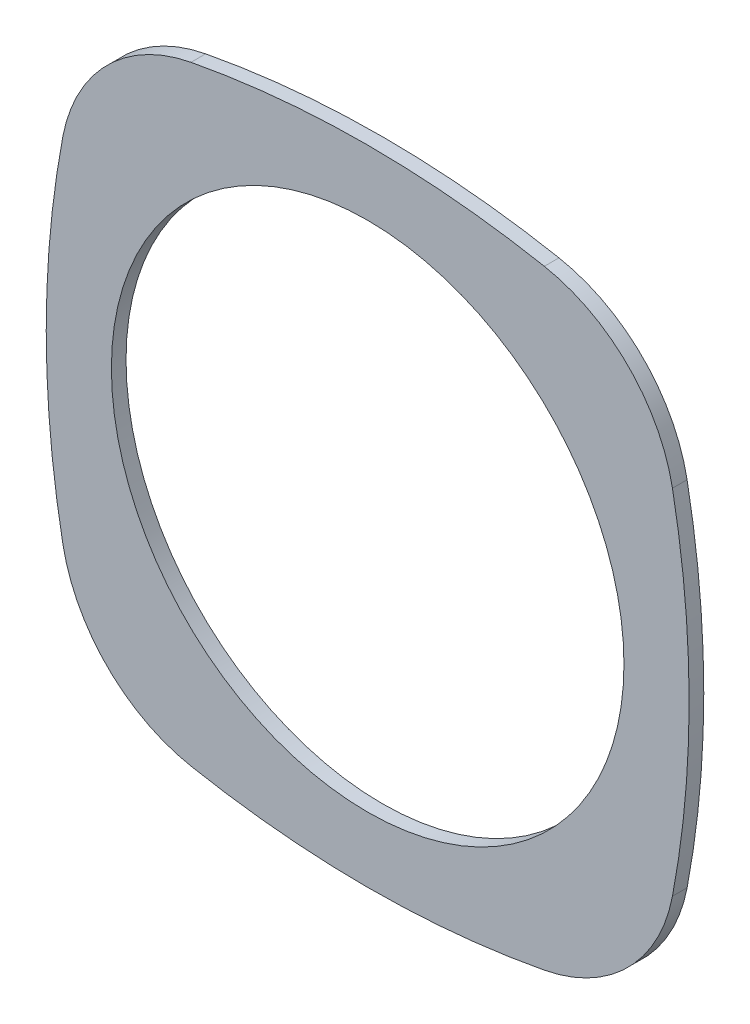
ISO-10303-21;
HEADER;
FILE_DESCRIPTION(('STEP AP214'),'2;1');
FILE_NAME('part.step','',(''),(''),'','','');
FILE_SCHEMA(('AUTOMOTIVE_DESIGN { 1 0 10303 214 1 1 1 1 }'));
ENDSEC;
DATA;
#1=APPLICATION_CONTEXT('core data for automotive mechanical design processes');
#2=APPLICATION_PROTOCOL_DEFINITION('international standard','automotive_design',2000,#1);
#3=PRODUCT_CONTEXT('',#1,'mechanical');
#4=PRODUCT('Part','Part','',(#3));
#5=PRODUCT_RELATED_PRODUCT_CATEGORY('part','',(#4));
#6=PRODUCT_DEFINITION_FORMATION('','',#4);
#7=PRODUCT_DEFINITION_CONTEXT('part definition',#1,'design');
#8=PRODUCT_DEFINITION('design','',#6,#7);
#9=PRODUCT_DEFINITION_SHAPE('','',#8);
#10=(LENGTH_UNIT() NAMED_UNIT(*) SI_UNIT(.MILLI.,.METRE.));
#11=(NAMED_UNIT(*) PLANE_ANGLE_UNIT() SI_UNIT($,.RADIAN.));
#12=(NAMED_UNIT(*) SI_UNIT($,.STERADIAN.) SOLID_ANGLE_UNIT());
#13=UNCERTAINTY_MEASURE_WITH_UNIT(LENGTH_MEASURE(1.E-05),#10,'distance_accuracy_value','');
#14=(GEOMETRIC_REPRESENTATION_CONTEXT(3) GLOBAL_UNCERTAINTY_ASSIGNED_CONTEXT((#13)) GLOBAL_UNIT_ASSIGNED_CONTEXT((#10,
#11,#12)) REPRESENTATION_CONTEXT('',''));
#15=CARTESIAN_POINT('',(0.,0.,0.));
#16=DIRECTION('',(0.,0.,1.));
#17=DIRECTION('',(1.,0.,0.));
#18=AXIS2_PLACEMENT_3D('',#15,#16,#17);
#19=CARTESIAN_POINT('',(5.00278047689482,-16.2585175185364,1.));
#20=DIRECTION('',(0.,0.,1.));
#21=DIRECTION('',(1.,0.,0.));
#22=AXIS2_PLACEMENT_3D('',#19,#20,#21);
#23=PLANE('',#22);
#24=CARTESIAN_POINT('',(10.0055609537896,10.0055609537896,1.));
#25=DIRECTION('',(0.,0.,1.));
#26=DIRECTION('',(1.,0.,0.));
#27=AXIS2_PLACEMENT_3D('',#24,#25,#26);
#28=CIRCLE('',#27,11.);
#29=CARTESIAN_POINT('',(20.8112777080297,12.0638333913293,1.));
#30=VERTEX_POINT('',#29);
#31=CARTESIAN_POINT('',(12.0638333913293,20.8112777080297,1.));
#32=VERTEX_POINT('',#31);
#33=EDGE_CURVE('E168',#30,#32,#28,.T.);
#34=ORIENTED_EDGE('',*,*,#33,.T.);
#35=CARTESIAN_POINT('',(0.,-42.5225959908624,1.));
#36=DIRECTION('',(0.,0.,1.));
#37=DIRECTION('',(1.,0.,0.));
#38=AXIS2_PLACEMENT_3D('',#35,#36,#37);
#39=CIRCLE('',#38,64.4725959908624);
#40=CARTESIAN_POINT('',(-12.0638333913293,20.8112777080297,1.));
#41=VERTEX_POINT('',#40);
#42=EDGE_CURVE('E104',#32,#41,#39,.T.);
#43=ORIENTED_EDGE('',*,*,#42,.T.);
#44=CARTESIAN_POINT('',(-10.0055609537896,10.0055609537896,1.));
#45=DIRECTION('',(0.,0.,1.));
#46=DIRECTION('',(1.,0.,0.));
#47=AXIS2_PLACEMENT_3D('',#44,#45,#46);
#48=CIRCLE('',#47,11.);
#49=CARTESIAN_POINT('',(-20.8112777080297,12.0638333913293,1.));
#50=VERTEX_POINT('',#49);
#51=EDGE_CURVE('E189',#41,#50,#48,.T.);
#52=ORIENTED_EDGE('',*,*,#51,.T.);
#53=CARTESIAN_POINT('',(42.5225959908624,0.,1.));
#54=DIRECTION('',(0.,0.,1.));
#55=DIRECTION('',(1.,0.,0.));
#56=AXIS2_PLACEMENT_3D('',#53,#54,#55);
#57=CIRCLE('',#56,64.4725959908624);
#58=CARTESIAN_POINT('',(-20.8112777080297,-12.0638333913293,1.));
#59=VERTEX_POINT('',#58);
#60=EDGE_CURVE('E203',#50,#59,#57,.T.);
#61=ORIENTED_EDGE('',*,*,#60,.T.);
#62=CARTESIAN_POINT('',(-10.0055609537896,-10.0055609537896,1.));
#63=DIRECTION('',(0.,0.,1.));
#64=DIRECTION('',(1.,0.,0.));
#65=AXIS2_PLACEMENT_3D('',#62,#63,#64);
#66=CIRCLE('',#65,11.);
#67=CARTESIAN_POINT('',(-12.0638333913293,-20.8112777080297,1.));
#68=VERTEX_POINT('',#67);
#69=EDGE_CURVE('E123',#59,#68,#66,.T.);
#70=ORIENTED_EDGE('',*,*,#69,.T.);
#71=CARTESIAN_POINT('',(0.,42.5225959908624,1.));
#72=DIRECTION('',(0.,0.,1.));
#73=DIRECTION('',(1.,0.,0.));
#74=AXIS2_PLACEMENT_3D('',#71,#72,#73);
#75=CIRCLE('',#74,64.4725959908624);
#76=CARTESIAN_POINT('',(12.0638333913293,-20.8112777080297,1.));
#77=VERTEX_POINT('',#76);
#78=EDGE_CURVE('E117',#68,#77,#75,.T.);
#79=ORIENTED_EDGE('',*,*,#78,.T.);
#80=CARTESIAN_POINT('',(10.0055609537896,-10.0055609537896,1.));
#81=DIRECTION('',(0.,0.,1.));
#82=DIRECTION('',(1.,0.,0.));
#83=AXIS2_PLACEMENT_3D('',#80,#81,#82);
#84=CIRCLE('',#83,11.);
#85=CARTESIAN_POINT('',(20.8112777080297,-12.0638333913293,1.));
#86=VERTEX_POINT('',#85);
#87=EDGE_CURVE('E121',#77,#86,#84,.T.);
#88=ORIENTED_EDGE('',*,*,#87,.T.);
#89=CARTESIAN_POINT('',(-42.5225959908624,0.,1.));
#90=DIRECTION('',(0.,0.,1.));
#91=DIRECTION('',(1.,0.,0.));
#92=AXIS2_PLACEMENT_3D('',#89,#90,#91);
#93=CIRCLE('',#92,64.4725959908624);
#94=EDGE_CURVE('E61',#86,#30,#93,.T.);
#95=ORIENTED_EDGE('',*,*,#94,.T.);
#96=EDGE_LOOP('',(#34,#43,#52,#61,#70,#79,#88,#95));
#97=FACE_BOUND('',#96,.T.);
#98=CARTESIAN_POINT('',(0.,0.,1.));
#99=DIRECTION('',(0.,0.,1.));
#100=DIRECTION('',(1.,0.,0.));
#101=AXIS2_PLACEMENT_3D('',#98,#99,#100);
#102=CIRCLE('',#101,17.5);
#103=CARTESIAN_POINT('',(17.5,0.,1.));
#104=VERTEX_POINT('',#103);
#105=EDGE_CURVE('E150',#104,#104,#102,.T.);
#106=ORIENTED_EDGE('',*,*,#105,.F.);
#107=EDGE_LOOP('',(#106));
#108=FACE_BOUND('',#107,.T.);
#109=ADVANCED_FACE('F43',(#97,#108),#23,.T.);
#110=CARTESIAN_POINT('',(5.00278047689482,-16.2585175185364,0.));
#111=DIRECTION('',(0.,0.,1.));
#112=DIRECTION('',(1.,0.,0.));
#113=AXIS2_PLACEMENT_3D('',#110,#111,#112);
#114=PLANE('',#113);
#115=CARTESIAN_POINT('',(10.0055609537896,10.0055609537896,0.));
#116=DIRECTION('',(0.,0.,1.));
#117=DIRECTION('',(1.,0.,0.));
#118=AXIS2_PLACEMENT_3D('',#115,#116,#117);
#119=CIRCLE('',#118,11.);
#120=CARTESIAN_POINT('',(20.8112777080297,12.0638333913293,0.));
#121=VERTEX_POINT('',#120);
#122=CARTESIAN_POINT('',(12.0638333913293,20.8112777080297,0.));
#123=VERTEX_POINT('',#122);
#124=EDGE_CURVE('E145',#121,#123,#119,.T.);
#125=ORIENTED_EDGE('',*,*,#124,.F.);
#126=CARTESIAN_POINT('',(-42.5225959908624,0.,0.));
#127=DIRECTION('',(0.,0.,1.));
#128=DIRECTION('',(1.,0.,0.));
#129=AXIS2_PLACEMENT_3D('',#126,#127,#128);
#130=CIRCLE('',#129,64.4725959908624);
#131=CARTESIAN_POINT('',(20.8112777080297,-12.0638333913293,0.));
#132=VERTEX_POINT('',#131);
#133=EDGE_CURVE('E96',#132,#121,#130,.T.);
#134=ORIENTED_EDGE('',*,*,#133,.F.);
#135=CARTESIAN_POINT('',(10.0055609537896,-10.0055609537896,0.));
#136=DIRECTION('',(0.,0.,1.));
#137=DIRECTION('',(1.,0.,0.));
#138=AXIS2_PLACEMENT_3D('',#135,#136,#137);
#139=CIRCLE('',#138,11.);
#140=CARTESIAN_POINT('',(12.0638333913293,-20.8112777080297,0.));
#141=VERTEX_POINT('',#140);
#142=EDGE_CURVE('E90',#141,#132,#139,.T.);
#143=ORIENTED_EDGE('',*,*,#142,.F.);
#144=CARTESIAN_POINT('',(0.,42.5225959908624,0.));
#145=DIRECTION('',(0.,0.,1.));
#146=DIRECTION('',(1.,0.,0.));
#147=AXIS2_PLACEMENT_3D('',#144,#145,#146);
#148=CIRCLE('',#147,64.4725959908624);
#149=CARTESIAN_POINT('',(-12.0638333913293,-20.8112777080297,0.));
#150=VERTEX_POINT('',#149);
#151=EDGE_CURVE('E132',#150,#141,#148,.T.);
#152=ORIENTED_EDGE('',*,*,#151,.F.);
#153=CARTESIAN_POINT('',(-10.0055609537896,-10.0055609537896,0.));
#154=DIRECTION('',(0.,0.,1.));
#155=DIRECTION('',(1.,0.,0.));
#156=AXIS2_PLACEMENT_3D('',#153,#154,#155);
#157=CIRCLE('',#156,11.);
#158=CARTESIAN_POINT('',(-20.8112777080297,-12.0638333913293,0.));
#159=VERTEX_POINT('',#158);
#160=EDGE_CURVE('E159',#159,#150,#157,.T.);
#161=ORIENTED_EDGE('',*,*,#160,.F.);
#162=CARTESIAN_POINT('',(42.5225959908624,0.,0.));
#163=DIRECTION('',(0.,0.,1.));
#164=DIRECTION('',(1.,0.,0.));
#165=AXIS2_PLACEMENT_3D('',#162,#163,#164);
#166=CIRCLE('',#165,64.4725959908624);
#167=CARTESIAN_POINT('',(-20.8112777080297,12.0638333913293,0.));
#168=VERTEX_POINT('',#167);
#169=EDGE_CURVE('E156',#168,#159,#166,.T.);
#170=ORIENTED_EDGE('',*,*,#169,.F.);
#171=CARTESIAN_POINT('',(-10.0055609537896,10.0055609537896,0.));
#172=DIRECTION('',(0.,0.,1.));
#173=DIRECTION('',(1.,0.,0.));
#174=AXIS2_PLACEMENT_3D('',#171,#172,#173);
#175=CIRCLE('',#174,11.);
#176=CARTESIAN_POINT('',(-12.0638333913293,20.8112777080297,0.));
#177=VERTEX_POINT('',#176);
#178=EDGE_CURVE('E153',#177,#168,#175,.T.);
#179=ORIENTED_EDGE('',*,*,#178,.F.);
#180=CARTESIAN_POINT('',(0.,-42.5225959908624,0.));
#181=DIRECTION('',(0.,0.,1.));
#182=DIRECTION('',(1.,0.,0.));
#183=AXIS2_PLACEMENT_3D('',#180,#181,#182);
#184=CIRCLE('',#183,64.4725959908624);
#185=EDGE_CURVE('E149',#123,#177,#184,.T.);
#186=ORIENTED_EDGE('',*,*,#185,.F.);
#187=EDGE_LOOP('',(#125,#134,#143,#152,#161,#170,#179,#186));
#188=FACE_BOUND('',#187,.T.);
#189=CARTESIAN_POINT('',(0.,0.,0.));
#190=DIRECTION('',(0.,0.,1.));
#191=DIRECTION('',(1.,0.,0.));
#192=AXIS2_PLACEMENT_3D('',#189,#190,#191);
#193=CIRCLE('',#192,17.5);
#194=CARTESIAN_POINT('',(17.5,0.,0.));
#195=VERTEX_POINT('',#194);
#196=EDGE_CURVE('E213',#195,#195,#193,.T.);
#197=ORIENTED_EDGE('',*,*,#196,.T.);
#198=EDGE_LOOP('',(#197));
#199=FACE_BOUND('',#198,.T.);
#200=ADVANCED_FACE('F193',(#188,#199),#114,.F.);
#201=CARTESIAN_POINT('',(10.0055609537896,10.0055609537896,1.));
#202=DIRECTION('',(0.,0.,-1.));
#203=DIRECTION('',(-1.,0.,0.));
#204=AXIS2_PLACEMENT_3D('',#201,#202,#203);
#205=CYLINDRICAL_SURFACE('',#204,11.);
#206=ORIENTED_EDGE('',*,*,#124,.T.);
#207=DIRECTION('',(0.,0.,-1.));
#208=VECTOR('',#207,1.);
#209=CARTESIAN_POINT('',(12.0638333913293,20.8112777080297,1.));
#210=LINE('',#209,#208);
#211=EDGE_CURVE('E11',#32,#123,#210,.T.);
#212=ORIENTED_EDGE('',*,*,#211,.F.);
#213=ORIENTED_EDGE('',*,*,#33,.F.);
#214=DIRECTION('',(0.,0.,-1.));
#215=VECTOR('',#214,1.);
#216=CARTESIAN_POINT('',(20.8112777080297,12.0638333913293,1.));
#217=LINE('',#216,#215);
#218=EDGE_CURVE('E141',#30,#121,#217,.T.);
#219=ORIENTED_EDGE('',*,*,#218,.T.);
#220=EDGE_LOOP('',(#206,#212,#213,#219));
#221=FACE_BOUND('',#220,.T.);
#222=ADVANCED_FACE('F45',(#221),#205,.T.);
#223=CARTESIAN_POINT('',(0.,-42.5225959908624,1.));
#224=DIRECTION('',(0.,0.,-1.));
#225=DIRECTION('',(-1.,0.,0.));
#226=AXIS2_PLACEMENT_3D('',#223,#224,#225);
#227=CYLINDRICAL_SURFACE('',#226,64.4725959908624);
#228=ORIENTED_EDGE('',*,*,#185,.T.);
#229=DIRECTION('',(0.,0.,-1.));
#230=VECTOR('',#229,1.);
#231=CARTESIAN_POINT('',(-12.0638333913293,20.8112777080297,1.));
#232=LINE('',#231,#230);
#233=EDGE_CURVE('E53',#41,#177,#232,.T.);
#234=ORIENTED_EDGE('',*,*,#233,.F.);
#235=ORIENTED_EDGE('',*,*,#42,.F.);
#236=ORIENTED_EDGE('',*,*,#211,.T.);
#237=EDGE_LOOP('',(#228,#234,#235,#236));
#238=FACE_BOUND('',#237,.T.);
#239=ADVANCED_FACE('F243',(#238),#227,.T.);
#240=CARTESIAN_POINT('',(-10.0055609537896,10.0055609537896,1.));
#241=DIRECTION('',(0.,0.,-1.));
#242=DIRECTION('',(-1.,0.,0.));
#243=AXIS2_PLACEMENT_3D('',#240,#241,#242);
#244=CYLINDRICAL_SURFACE('',#243,11.);
#245=ORIENTED_EDGE('',*,*,#178,.T.);
#246=DIRECTION('',(0.,0.,-1.));
#247=VECTOR('',#246,1.);
#248=CARTESIAN_POINT('',(-20.8112777080297,12.0638333913293,1.));
#249=LINE('',#248,#247);
#250=EDGE_CURVE('E179',#50,#168,#249,.T.);
#251=ORIENTED_EDGE('',*,*,#250,.F.);
#252=ORIENTED_EDGE('',*,*,#51,.F.);
#253=ORIENTED_EDGE('',*,*,#233,.T.);
#254=EDGE_LOOP('',(#245,#251,#252,#253));
#255=FACE_BOUND('',#254,.T.);
#256=ADVANCED_FACE('F187',(#255),#244,.T.);
#257=CARTESIAN_POINT('',(42.5225959908624,0.,1.));
#258=DIRECTION('',(0.,0.,-1.));
#259=DIRECTION('',(-1.,0.,0.));
#260=AXIS2_PLACEMENT_3D('',#257,#258,#259);
#261=CYLINDRICAL_SURFACE('',#260,64.4725959908624);
#262=ORIENTED_EDGE('',*,*,#169,.T.);
#263=DIRECTION('',(0.,0.,-1.));
#264=VECTOR('',#263,1.);
#265=CARTESIAN_POINT('',(-20.8112777080297,-12.0638333913293,1.));
#266=LINE('',#265,#264);
#267=EDGE_CURVE('E175',#59,#159,#266,.T.);
#268=ORIENTED_EDGE('',*,*,#267,.F.);
#269=ORIENTED_EDGE('',*,*,#60,.F.);
#270=ORIENTED_EDGE('',*,*,#250,.T.);
#271=EDGE_LOOP('',(#262,#268,#269,#270));
#272=FACE_BOUND('',#271,.T.);
#273=ADVANCED_FACE('F198',(#272),#261,.T.);
#274=CARTESIAN_POINT('',(-10.0055609537896,-10.0055609537896,1.));
#275=DIRECTION('',(0.,0.,-1.));
#276=DIRECTION('',(-1.,0.,0.));
#277=AXIS2_PLACEMENT_3D('',#274,#275,#276);
#278=CYLINDRICAL_SURFACE('',#277,11.);
#279=ORIENTED_EDGE('',*,*,#160,.T.);
#280=DIRECTION('',(0.,0.,-1.));
#281=VECTOR('',#280,1.);
#282=CARTESIAN_POINT('',(-12.0638333913293,-20.8112777080297,1.));
#283=LINE('',#282,#281);
#284=EDGE_CURVE('E134',#68,#150,#283,.T.);
#285=ORIENTED_EDGE('',*,*,#284,.F.);
#286=ORIENTED_EDGE('',*,*,#69,.F.);
#287=ORIENTED_EDGE('',*,*,#267,.T.);
#288=EDGE_LOOP('',(#279,#285,#286,#287));
#289=FACE_BOUND('',#288,.T.);
#290=ADVANCED_FACE('F201',(#289),#278,.T.);
#291=CARTESIAN_POINT('',(0.,42.5225959908624,1.));
#292=DIRECTION('',(0.,0.,-1.));
#293=DIRECTION('',(-1.,0.,0.));
#294=AXIS2_PLACEMENT_3D('',#291,#292,#293);
#295=CYLINDRICAL_SURFACE('',#294,64.4725959908624);
#296=ORIENTED_EDGE('',*,*,#151,.T.);
#297=DIRECTION('',(0.,0.,-1.));
#298=VECTOR('',#297,1.);
#299=CARTESIAN_POINT('',(12.0638333913293,-20.8112777080297,1.));
#300=LINE('',#299,#298);
#301=EDGE_CURVE('E129',#77,#141,#300,.T.);
#302=ORIENTED_EDGE('',*,*,#301,.F.);
#303=ORIENTED_EDGE('',*,*,#78,.F.);
#304=ORIENTED_EDGE('',*,*,#284,.T.);
#305=EDGE_LOOP('',(#296,#302,#303,#304));
#306=FACE_BOUND('',#305,.T.);
#307=ADVANCED_FACE('F130',(#306),#295,.T.);
#308=CARTESIAN_POINT('',(10.0055609537896,-10.0055609537896,1.));
#309=DIRECTION('',(0.,0.,-1.));
#310=DIRECTION('',(-1.,0.,0.));
#311=AXIS2_PLACEMENT_3D('',#308,#309,#310);
#312=CYLINDRICAL_SURFACE('',#311,11.);
#313=ORIENTED_EDGE('',*,*,#142,.T.);
#314=DIRECTION('',(0.,0.,-1.));
#315=VECTOR('',#314,1.);
#316=CARTESIAN_POINT('',(20.8112777080297,-12.0638333913293,1.));
#317=LINE('',#316,#315);
#318=EDGE_CURVE('E135',#86,#132,#317,.T.);
#319=ORIENTED_EDGE('',*,*,#318,.F.);
#320=ORIENTED_EDGE('',*,*,#87,.F.);
#321=ORIENTED_EDGE('',*,*,#301,.T.);
#322=EDGE_LOOP('',(#313,#319,#320,#321));
#323=FACE_BOUND('',#322,.T.);
#324=ADVANCED_FACE('F137',(#323),#312,.T.);
#325=CARTESIAN_POINT('',(-42.5225959908624,0.,1.));
#326=DIRECTION('',(0.,0.,-1.));
#327=DIRECTION('',(-1.,0.,0.));
#328=AXIS2_PLACEMENT_3D('',#325,#326,#327);
#329=CYLINDRICAL_SURFACE('',#328,64.4725959908624);
#330=ORIENTED_EDGE('',*,*,#133,.T.);
#331=ORIENTED_EDGE('',*,*,#218,.F.);
#332=ORIENTED_EDGE('',*,*,#94,.F.);
#333=ORIENTED_EDGE('',*,*,#318,.T.);
#334=EDGE_LOOP('',(#330,#331,#332,#333));
#335=FACE_BOUND('',#334,.T.);
#336=ADVANCED_FACE('F231',(#335),#329,.T.);
#337=CARTESIAN_POINT('',(0.,0.,1.));
#338=DIRECTION('',(0.,0.,-1.));
#339=DIRECTION('',(-1.,0.,0.));
#340=AXIS2_PLACEMENT_3D('',#337,#338,#339);
#341=CYLINDRICAL_SURFACE('',#340,17.5);
#342=ORIENTED_EDGE('',*,*,#105,.T.);
#343=EDGE_LOOP('',(#342));
#344=FACE_BOUND('',#343,.T.);
#345=ORIENTED_EDGE('',*,*,#196,.F.);
#346=EDGE_LOOP('',(#345));
#347=FACE_BOUND('',#346,.T.);
#348=ADVANCED_FACE('F221',(#344,#347),#341,.F.);
#349=CLOSED_SHELL('',(#109,#200,#222,#239,#256,#273,#290,#307,#324,#336,#348));
#350=MANIFOLD_SOLID_BREP('B2',#349);
#351=ADVANCED_BREP_SHAPE_REPRESENTATION('',(#18,#350),#14);
#352=SHAPE_DEFINITION_REPRESENTATION(#9,#351);
ENDSEC;
END-ISO-10303-21;
